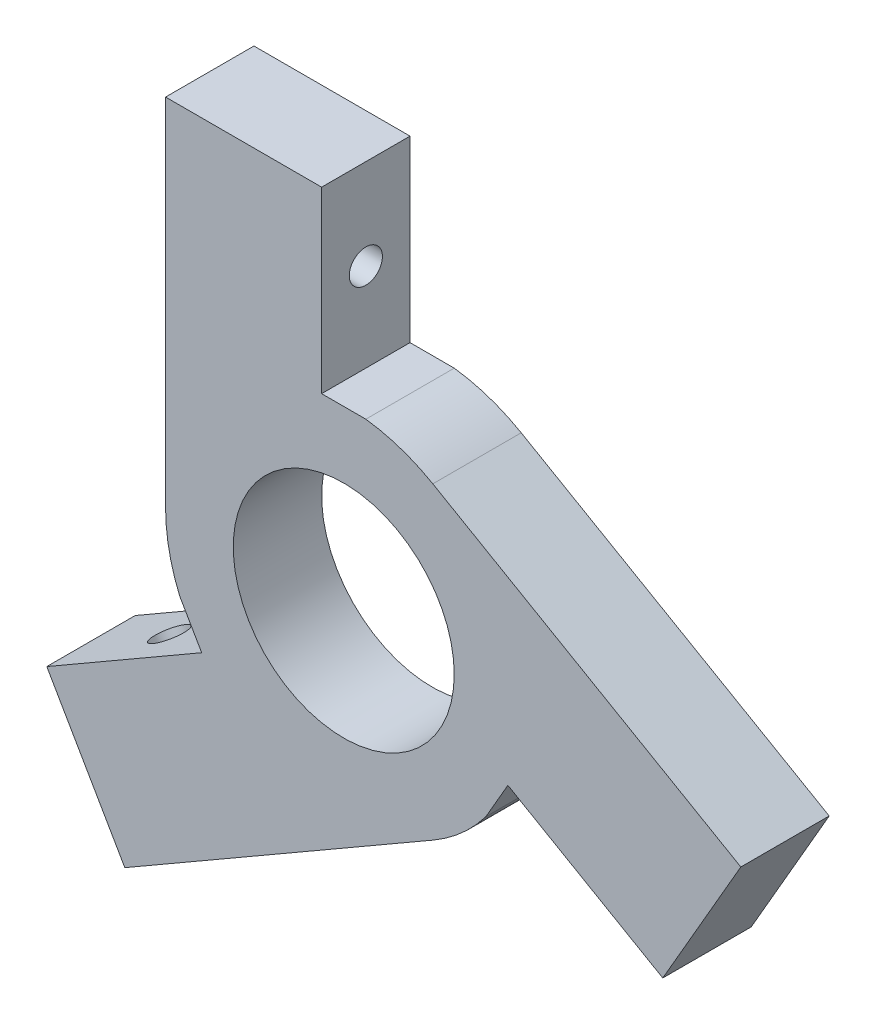
ISO-10303-21;
HEADER;
FILE_DESCRIPTION(('STEP AP214'),'2;1');
FILE_NAME('part.step','',(''),(''),'','','');
FILE_SCHEMA(('AUTOMOTIVE_DESIGN { 1 0 10303 214 1 1 1 1 }'));
ENDSEC;
DATA;
#1=APPLICATION_CONTEXT('core data for automotive mechanical design processes');
#2=APPLICATION_PROTOCOL_DEFINITION('international standard','automotive_design',2000,#1);
#3=PRODUCT_CONTEXT('',#1,'mechanical');
#4=PRODUCT('Part','Part','',(#3));
#5=PRODUCT_RELATED_PRODUCT_CATEGORY('part','',(#4));
#6=PRODUCT_DEFINITION_FORMATION('','',#4);
#7=PRODUCT_DEFINITION_CONTEXT('part definition',#1,'design');
#8=PRODUCT_DEFINITION('design','',#6,#7);
#9=PRODUCT_DEFINITION_SHAPE('','',#8);
#10=(LENGTH_UNIT() NAMED_UNIT(*) SI_UNIT(.MILLI.,.METRE.));
#11=(NAMED_UNIT(*) PLANE_ANGLE_UNIT() SI_UNIT($,.RADIAN.));
#12=(NAMED_UNIT(*) SI_UNIT($,.STERADIAN.) SOLID_ANGLE_UNIT());
#13=UNCERTAINTY_MEASURE_WITH_UNIT(LENGTH_MEASURE(1.E-05),#10,'distance_accuracy_value','');
#14=(GEOMETRIC_REPRESENTATION_CONTEXT(3) GLOBAL_UNCERTAINTY_ASSIGNED_CONTEXT((#13)) GLOBAL_UNIT_ASSIGNED_CONTEXT((#10,
#11,#12)) REPRESENTATION_CONTEXT('',''));
#15=CARTESIAN_POINT('',(0.,0.,0.));
#16=DIRECTION('',(0.,0.,1.));
#17=DIRECTION('',(1.,0.,0.));
#18=AXIS2_PLACEMENT_3D('',#15,#16,#17);
#19=CARTESIAN_POINT('',(0.,0.,12.7));
#20=DIRECTION('',(0.,0.,1.));
#21=DIRECTION('',(1.,0.,0.));
#22=AXIS2_PLACEMENT_3D('',#19,#20,#21);
#23=PLANE('',#22);
#24=CARTESIAN_POINT('',(0.,0.,12.7));
#25=DIRECTION('',(0.,0.,1.));
#26=DIRECTION('',(1.,0.,0.));
#27=AXIS2_PLACEMENT_3D('',#24,#25,#26);
#28=CIRCLE('',#27,51.1953367016958);
#29=CARTESIAN_POINT('',(25.5976683508479,44.3364621389664,12.7));
#30=VERTEX_POINT('',#29);
#31=CARTESIAN_POINT('',(6.35000000000002,50.8,12.7));
#32=VERTEX_POINT('',#31);
#33=EDGE_CURVE('E204',#30,#32,#28,.T.);
#34=ORIENTED_EDGE('',*,*,#33,.T.);
#35=DIRECTION('',(-1.,0.,0.));
#36=VECTOR('',#35,1.);
#37=CARTESIAN_POINT('',(-6.34999999999998,50.8,12.7));
#38=LINE('',#37,#36);
#39=CARTESIAN_POINT('',(-6.34999999999998,50.8,12.7));
#40=VERTEX_POINT('',#39);
#41=EDGE_CURVE('E117',#32,#40,#38,.T.);
#42=ORIENTED_EDGE('',*,*,#41,.T.);
#43=DIRECTION('',(0.,1.,0.));
#44=VECTOR('',#43,1.);
#45=CARTESIAN_POINT('',(-6.35000000000016,102.193578565387,12.7));
#46=LINE('',#45,#44);
#47=CARTESIAN_POINT('',(-6.35000000000016,102.193578565387,12.7));
#48=VERTEX_POINT('',#47);
#49=EDGE_CURVE('E240',#40,#48,#46,.T.);
#50=ORIENTED_EDGE('',*,*,#49,.T.);
#51=DIRECTION('',(-1.,0.,0.));
#52=VECTOR('',#51,1.);
#53=CARTESIAN_POINT('',(-51.1953367016961,102.193578565387,12.7));
#54=LINE('',#53,#52);
#55=CARTESIAN_POINT('',(-51.1953367016961,102.193578565387,12.7));
#56=VERTEX_POINT('',#55);
#57=EDGE_CURVE('E259',#48,#56,#54,.T.);
#58=ORIENTED_EDGE('',*,*,#57,.T.);
#59=DIRECTION('',(0.,-1.,0.));
#60=VECTOR('',#59,1.);
#61=CARTESIAN_POINT('',(-51.1953367016958,0.,12.7));
#62=LINE('',#61,#60);
#63=CARTESIAN_POINT('',(-51.1953367016958,0.,12.7));
#64=VERTEX_POINT('',#63);
#65=EDGE_CURVE('E256',#56,#64,#62,.T.);
#66=ORIENTED_EDGE('',*,*,#65,.T.);
#67=CARTESIAN_POINT('',(0.,0.,12.7));
#68=DIRECTION('',(0.,0.,1.));
#69=DIRECTION('',(1.,0.,0.));
#70=AXIS2_PLACEMENT_3D('',#67,#68,#69);
#71=CIRCLE('',#70,51.1953367016958);
#72=CARTESIAN_POINT('',(-47.1690905122495,-19.9007386859688,12.7));
#73=VERTEX_POINT('',#72);
#74=EDGE_CURVE('E258',#64,#73,#71,.T.);
#75=ORIENTED_EDGE('',*,*,#74,.T.);
#76=DIRECTION('',(0.5,-0.866025403784439,0.));
#77=VECTOR('',#76,1.);
#78=CARTESIAN_POINT('',(-40.8190905122495,-30.8992613140312,12.7));
#79=LINE('',#78,#77);
#80=CARTESIAN_POINT('',(-40.8190905122495,-30.8992613140312,12.7));
#81=VERTEX_POINT('',#80);
#82=EDGE_CURVE('E261',#73,#81,#79,.T.);
#83=ORIENTED_EDGE('',*,*,#82,.T.);
#84=DIRECTION('',(-0.866025403784438,-0.500000000000001,0.));
#85=VECTOR('',#84,1.);
#86=CARTESIAN_POINT('',(-85.3272351412662,-56.5960505967249,12.7));
#87=LINE('',#86,#85);
#88=CARTESIAN_POINT('',(-85.3272351412662,-56.5960505967249,12.7));
#89=VERTEX_POINT('',#88);
#90=EDGE_CURVE('E267',#81,#89,#87,.T.);
#91=ORIENTED_EDGE('',*,*,#90,.T.);
#92=DIRECTION('',(0.499999999999999,-0.866025403784439,0.));
#93=VECTOR('',#92,1.);
#94=CARTESIAN_POINT('',(-62.9045667904184,-95.4332514216601,12.7));
#95=LINE('',#94,#93);
#96=CARTESIAN_POINT('',(-62.9045667904184,-95.4332514216601,12.7));
#97=VERTEX_POINT('',#96);
#98=EDGE_CURVE('E269',#89,#97,#95,.T.);
#99=ORIENTED_EDGE('',*,*,#98,.T.);
#100=DIRECTION('',(0.866025403784438,0.500000000000001,0.));
#101=VECTOR('',#100,1.);
#102=CARTESIAN_POINT('',(25.5976683508479,-44.3364621389664,12.7));
#103=LINE('',#102,#101);
#104=CARTESIAN_POINT('',(25.5976683508479,-44.3364621389664,12.7));
#105=VERTEX_POINT('',#104);
#106=EDGE_CURVE('E271',#97,#105,#103,.T.);
#107=ORIENTED_EDGE('',*,*,#106,.T.);
#108=CARTESIAN_POINT('',(0.,0.,12.7));
#109=DIRECTION('',(0.,0.,1.));
#110=DIRECTION('',(1.,0.,0.));
#111=AXIS2_PLACEMENT_3D('',#108,#109,#110);
#112=CIRCLE('',#111,51.1953367016958);
#113=CARTESIAN_POINT('',(40.8190905122495,-30.8992613140312,12.7));
#114=VERTEX_POINT('',#113);
#115=EDGE_CURVE('E273',#105,#114,#112,.T.);
#116=ORIENTED_EDGE('',*,*,#115,.T.);
#117=DIRECTION('',(0.5,0.866025403784439,0.));
#118=VECTOR('',#117,1.);
#119=CARTESIAN_POINT('',(47.1690905122495,-19.9007386859688,12.7));
#120=LINE('',#119,#118);
#121=CARTESIAN_POINT('',(47.1690905122495,-19.9007386859688,12.7));
#122=VERTEX_POINT('',#121);
#123=EDGE_CURVE('E157',#114,#122,#120,.T.);
#124=ORIENTED_EDGE('',*,*,#123,.T.);
#125=DIRECTION('',(0.866025403784439,-0.5,0.));
#126=VECTOR('',#125,1.);
#127=CARTESIAN_POINT('',(91.6772351412663,-45.5975279686624,12.7));
#128=LINE('',#127,#126);
#129=CARTESIAN_POINT('',(91.6772351412663,-45.5975279686624,12.7));
#130=VERTEX_POINT('',#129);
#131=EDGE_CURVE('E151',#122,#130,#128,.T.);
#132=ORIENTED_EDGE('',*,*,#131,.T.);
#133=DIRECTION('',(0.500000000000001,0.866025403784438,0.));
#134=VECTOR('',#133,1.);
#135=CARTESIAN_POINT('',(114.099903492114,-6.76032714372728,12.7));
#136=LINE('',#135,#134);
#137=CARTESIAN_POINT('',(114.099903492114,-6.76032714372728,12.7));
#138=VERTEX_POINT('',#137);
#139=EDGE_CURVE('E155',#130,#138,#136,.T.);
#140=ORIENTED_EDGE('',*,*,#139,.T.);
#141=DIRECTION('',(-0.866025403784439,0.5,0.));
#142=VECTOR('',#141,1.);
#143=CARTESIAN_POINT('',(25.5976683508479,44.3364621389664,12.7));
#144=LINE('',#143,#142);
#145=EDGE_CURVE('E53',#138,#30,#144,.T.);
#146=ORIENTED_EDGE('',*,*,#145,.T.);
#147=EDGE_LOOP('',(#34,#42,#50,#58,#66,#75,#83,#91,#99,#107,#116,#124,#132,#140,#146));
#148=FACE_BOUND('',#147,.T.);
#149=CARTESIAN_POINT('',(0.,0.,12.7));
#150=DIRECTION('',(0.,0.,1.));
#151=DIRECTION('',(1.,0.,0.));
#152=AXIS2_PLACEMENT_3D('',#149,#150,#151);
#153=CIRCLE('',#152,31.75);
#154=CARTESIAN_POINT('',(31.75,0.,12.7));
#155=VERTEX_POINT('',#154);
#156=EDGE_CURVE('E179',#155,#155,#153,.T.);
#157=ORIENTED_EDGE('',*,*,#156,.F.);
#158=EDGE_LOOP('',(#157));
#159=FACE_BOUND('',#158,.T.);
#160=ADVANCED_FACE('F36',(#148,#159),#23,.T.);
#161=CARTESIAN_POINT('',(0.,0.,-12.7));
#162=DIRECTION('',(0.,0.,1.));
#163=DIRECTION('',(1.,0.,0.));
#164=AXIS2_PLACEMENT_3D('',#161,#162,#163);
#165=PLANE('',#164);
#166=CARTESIAN_POINT('',(0.,0.,-12.7));
#167=DIRECTION('',(0.,0.,1.));
#168=DIRECTION('',(1.,0.,0.));
#169=AXIS2_PLACEMENT_3D('',#166,#167,#168);
#170=CIRCLE('',#169,51.1953367016958);
#171=CARTESIAN_POINT('',(25.5976683508479,44.3364621389664,-12.7));
#172=VERTEX_POINT('',#171);
#173=CARTESIAN_POINT('',(6.35000000000002,50.8,-12.7));
#174=VERTEX_POINT('',#173);
#175=EDGE_CURVE('E175',#172,#174,#170,.T.);
#176=ORIENTED_EDGE('',*,*,#175,.F.);
#177=DIRECTION('',(-0.866025403784439,0.5,0.));
#178=VECTOR('',#177,1.);
#179=CARTESIAN_POINT('',(25.5976683508479,44.3364621389664,-12.7));
#180=LINE('',#179,#178);
#181=CARTESIAN_POINT('',(114.099903492114,-6.76032714372728,-12.7));
#182=VERTEX_POINT('',#181);
#183=EDGE_CURVE('E109',#182,#172,#180,.T.);
#184=ORIENTED_EDGE('',*,*,#183,.F.);
#185=DIRECTION('',(0.500000000000001,0.866025403784438,0.));
#186=VECTOR('',#185,1.);
#187=CARTESIAN_POINT('',(114.099903492114,-6.76032714372728,-12.7));
#188=LINE('',#187,#186);
#189=CARTESIAN_POINT('',(91.6772351412663,-45.5975279686624,-12.7));
#190=VERTEX_POINT('',#189);
#191=EDGE_CURVE('E103',#190,#182,#188,.T.);
#192=ORIENTED_EDGE('',*,*,#191,.F.);
#193=DIRECTION('',(0.866025403784439,-0.5,0.));
#194=VECTOR('',#193,1.);
#195=CARTESIAN_POINT('',(91.6772351412663,-45.5975279686624,-12.7));
#196=LINE('',#195,#194);
#197=CARTESIAN_POINT('',(47.1690905122495,-19.9007386859688,-12.7));
#198=VERTEX_POINT('',#197);
#199=EDGE_CURVE('E165',#198,#190,#196,.T.);
#200=ORIENTED_EDGE('',*,*,#199,.F.);
#201=DIRECTION('',(0.5,0.866025403784439,0.));
#202=VECTOR('',#201,1.);
#203=CARTESIAN_POINT('',(47.1690905122495,-19.9007386859688,-12.7));
#204=LINE('',#203,#202);
#205=CARTESIAN_POINT('',(40.8190905122495,-30.8992613140312,-12.7));
#206=VERTEX_POINT('',#205);
#207=EDGE_CURVE('E199',#206,#198,#204,.T.);
#208=ORIENTED_EDGE('',*,*,#207,.F.);
#209=CARTESIAN_POINT('',(0.,0.,-12.7));
#210=DIRECTION('',(0.,0.,1.));
#211=DIRECTION('',(1.,0.,0.));
#212=AXIS2_PLACEMENT_3D('',#209,#210,#211);
#213=CIRCLE('',#212,51.1953367016958);
#214=CARTESIAN_POINT('',(25.5976683508479,-44.3364621389664,-12.7));
#215=VERTEX_POINT('',#214);
#216=EDGE_CURVE('E197',#215,#206,#213,.T.);
#217=ORIENTED_EDGE('',*,*,#216,.F.);
#218=DIRECTION('',(0.866025403784438,0.500000000000001,0.));
#219=VECTOR('',#218,1.);
#220=CARTESIAN_POINT('',(25.5976683508479,-44.3364621389664,-12.7));
#221=LINE('',#220,#219);
#222=CARTESIAN_POINT('',(-62.9045667904184,-95.4332514216601,-12.7));
#223=VERTEX_POINT('',#222);
#224=EDGE_CURVE('E195',#223,#215,#221,.T.);
#225=ORIENTED_EDGE('',*,*,#224,.F.);
#226=DIRECTION('',(0.499999999999999,-0.866025403784439,0.));
#227=VECTOR('',#226,1.);
#228=CARTESIAN_POINT('',(-62.9045667904184,-95.4332514216601,-12.7));
#229=LINE('',#228,#227);
#230=CARTESIAN_POINT('',(-85.3272351412662,-56.5960505967249,-12.7));
#231=VERTEX_POINT('',#230);
#232=EDGE_CURVE('E193',#231,#223,#229,.T.);
#233=ORIENTED_EDGE('',*,*,#232,.F.);
#234=DIRECTION('',(-0.866025403784438,-0.500000000000001,0.));
#235=VECTOR('',#234,1.);
#236=CARTESIAN_POINT('',(-85.3272351412662,-56.5960505967249,-12.7));
#237=LINE('',#236,#235);
#238=CARTESIAN_POINT('',(-40.8190905122495,-30.8992613140312,-12.7));
#239=VERTEX_POINT('',#238);
#240=EDGE_CURVE('E191',#239,#231,#237,.T.);
#241=ORIENTED_EDGE('',*,*,#240,.F.);
#242=DIRECTION('',(0.5,-0.866025403784439,0.));
#243=VECTOR('',#242,1.);
#244=CARTESIAN_POINT('',(-40.8190905122495,-30.8992613140312,-12.7));
#245=LINE('',#244,#243);
#246=CARTESIAN_POINT('',(-47.1690905122495,-19.9007386859688,-12.7));
#247=VERTEX_POINT('',#246);
#248=EDGE_CURVE('E189',#247,#239,#245,.T.);
#249=ORIENTED_EDGE('',*,*,#248,.F.);
#250=CARTESIAN_POINT('',(0.,0.,-12.7));
#251=DIRECTION('',(0.,0.,1.));
#252=DIRECTION('',(1.,0.,0.));
#253=AXIS2_PLACEMENT_3D('',#250,#251,#252);
#254=CIRCLE('',#253,51.1953367016958);
#255=CARTESIAN_POINT('',(-51.1953367016958,0.,-12.7));
#256=VERTEX_POINT('',#255);
#257=EDGE_CURVE('E187',#256,#247,#254,.T.);
#258=ORIENTED_EDGE('',*,*,#257,.F.);
#259=DIRECTION('',(0.,-1.,0.));
#260=VECTOR('',#259,1.);
#261=CARTESIAN_POINT('',(-51.1953367016958,0.,-12.7));
#262=LINE('',#261,#260);
#263=CARTESIAN_POINT('',(-51.1953367016961,102.193578565387,-12.7));
#264=VERTEX_POINT('',#263);
#265=EDGE_CURVE('E185',#264,#256,#262,.T.);
#266=ORIENTED_EDGE('',*,*,#265,.F.);
#267=DIRECTION('',(-1.,0.,0.));
#268=VECTOR('',#267,1.);
#269=CARTESIAN_POINT('',(-51.1953367016961,102.193578565387,-12.7));
#270=LINE('',#269,#268);
#271=CARTESIAN_POINT('',(-6.35000000000016,102.193578565387,-12.7));
#272=VERTEX_POINT('',#271);
#273=EDGE_CURVE('E183',#272,#264,#270,.T.);
#274=ORIENTED_EDGE('',*,*,#273,.F.);
#275=DIRECTION('',(0.,1.,0.));
#276=VECTOR('',#275,1.);
#277=CARTESIAN_POINT('',(-6.35000000000016,102.193578565387,-12.7));
#278=LINE('',#277,#276);
#279=CARTESIAN_POINT('',(-6.34999999999998,50.8,-12.7));
#280=VERTEX_POINT('',#279);
#281=EDGE_CURVE('E181',#280,#272,#278,.T.);
#282=ORIENTED_EDGE('',*,*,#281,.F.);
#283=DIRECTION('',(-1.,0.,0.));
#284=VECTOR('',#283,1.);
#285=CARTESIAN_POINT('',(-6.34999999999998,50.8,-12.7));
#286=LINE('',#285,#284);
#287=EDGE_CURVE('E178',#174,#280,#286,.T.);
#288=ORIENTED_EDGE('',*,*,#287,.F.);
#289=EDGE_LOOP('',(#176,#184,#192,#200,#208,#217,#225,#233,#241,#249,#258,#266,#274,#282,#288));
#290=FACE_BOUND('',#289,.T.);
#291=CARTESIAN_POINT('',(0.,0.,-12.7));
#292=DIRECTION('',(0.,0.,1.));
#293=DIRECTION('',(1.,0.,0.));
#294=AXIS2_PLACEMENT_3D('',#291,#292,#293);
#295=CIRCLE('',#294,31.75);
#296=CARTESIAN_POINT('',(31.75,0.,-12.7));
#297=VERTEX_POINT('',#296);
#298=EDGE_CURVE('E349',#297,#297,#295,.T.);
#299=ORIENTED_EDGE('',*,*,#298,.T.);
#300=EDGE_LOOP('',(#299));
#301=FACE_BOUND('',#300,.T.);
#302=ADVANCED_FACE('F244',(#290,#301),#165,.F.);
#303=CARTESIAN_POINT('',(0.,0.,12.7));
#304=DIRECTION('',(0.,0.,-1.));
#305=DIRECTION('',(-1.,0.,0.));
#306=AXIS2_PLACEMENT_3D('',#303,#304,#305);
#307=CYLINDRICAL_SURFACE('',#306,51.1953367016958);
#308=ORIENTED_EDGE('',*,*,#175,.T.);
#309=DIRECTION('',(0.,0.,-1.));
#310=VECTOR('',#309,1.);
#311=CARTESIAN_POINT('',(6.35000000000002,50.8,12.7));
#312=LINE('',#311,#310);
#313=EDGE_CURVE('E11',#32,#174,#312,.T.);
#314=ORIENTED_EDGE('',*,*,#313,.F.);
#315=ORIENTED_EDGE('',*,*,#33,.F.);
#316=DIRECTION('',(0.,0.,-1.));
#317=VECTOR('',#316,1.);
#318=CARTESIAN_POINT('',(25.5976683508479,44.3364621389664,12.7));
#319=LINE('',#318,#317);
#320=EDGE_CURVE('E171',#30,#172,#319,.T.);
#321=ORIENTED_EDGE('',*,*,#320,.T.);
#322=EDGE_LOOP('',(#308,#314,#315,#321));
#323=FACE_BOUND('',#322,.T.);
#324=ADVANCED_FACE('F38',(#323),#307,.T.);
#325=CARTESIAN_POINT('',(-6.34999999999998,50.8,12.7));
#326=DIRECTION('',(0.,-1.,0.));
#327=DIRECTION('',(0.,0.,-1.));
#328=AXIS2_PLACEMENT_3D('',#325,#326,#327);
#329=PLANE('',#328);
#330=ORIENTED_EDGE('',*,*,#287,.T.);
#331=DIRECTION('',(0.,0.,-1.));
#332=VECTOR('',#331,1.);
#333=CARTESIAN_POINT('',(-6.34999999999998,50.8,12.7));
#334=LINE('',#333,#332);
#335=EDGE_CURVE('E45',#40,#280,#334,.T.);
#336=ORIENTED_EDGE('',*,*,#335,.F.);
#337=ORIENTED_EDGE('',*,*,#41,.F.);
#338=ORIENTED_EDGE('',*,*,#313,.T.);
#339=EDGE_LOOP('',(#330,#336,#337,#338));
#340=FACE_BOUND('',#339,.T.);
#341=ADVANCED_FACE('F364',(#340),#329,.F.);
#342=CARTESIAN_POINT('',(-6.35000000000016,102.193578565387,12.7));
#343=DIRECTION('',(-1.,0.,0.));
#344=DIRECTION('',(0.,-1.,0.));
#345=AXIS2_PLACEMENT_3D('',#342,#343,#344);
#346=PLANE('',#345);
#347=CARTESIAN_POINT('',(-6.35000000000007,76.2,0.));
#348=DIRECTION('',(1.,0.,0.));
#349=DIRECTION('',(0.,1.,0.));
#350=AXIS2_PLACEMENT_3D('',#347,#348,#349);
#351=CIRCLE('',#350,4.7625);
#352=CARTESIAN_POINT('',(-6.35000000000008,80.9625,0.));
#353=VERTEX_POINT('',#352);
#354=EDGE_CURVE('E333',#353,#353,#351,.T.);
#355=ORIENTED_EDGE('',*,*,#354,.F.);
#356=EDGE_LOOP('',(#355));
#357=FACE_BOUND('',#356,.T.);
#358=ORIENTED_EDGE('',*,*,#281,.T.);
#359=DIRECTION('',(0.,0.,-1.));
#360=VECTOR('',#359,1.);
#361=CARTESIAN_POINT('',(-6.35000000000016,102.193578565387,12.7));
#362=LINE('',#361,#360);
#363=EDGE_CURVE('E232',#48,#272,#362,.T.);
#364=ORIENTED_EDGE('',*,*,#363,.F.);
#365=ORIENTED_EDGE('',*,*,#49,.F.);
#366=ORIENTED_EDGE('',*,*,#335,.T.);
#367=EDGE_LOOP('',(#358,#364,#365,#366));
#368=FACE_BOUND('',#367,.T.);
#369=ADVANCED_FACE('F238',(#357,#368),#346,.F.);
#370=CARTESIAN_POINT('',(-51.1953367016961,102.193578565387,12.7));
#371=DIRECTION('',(0.,-1.,0.));
#372=DIRECTION('',(0.,0.,-1.));
#373=AXIS2_PLACEMENT_3D('',#370,#371,#372);
#374=PLANE('',#373);
#375=ORIENTED_EDGE('',*,*,#273,.T.);
#376=DIRECTION('',(0.,0.,-1.));
#377=VECTOR('',#376,1.);
#378=CARTESIAN_POINT('',(-51.1953367016961,102.193578565387,12.7));
#379=LINE('',#378,#377);
#380=EDGE_CURVE('E229',#56,#264,#379,.T.);
#381=ORIENTED_EDGE('',*,*,#380,.F.);
#382=ORIENTED_EDGE('',*,*,#57,.F.);
#383=ORIENTED_EDGE('',*,*,#363,.T.);
#384=EDGE_LOOP('',(#375,#381,#382,#383));
#385=FACE_BOUND('',#384,.T.);
#386=ADVANCED_FACE('F250',(#385),#374,.F.);
#387=CARTESIAN_POINT('',(-51.1953367016958,0.,12.7));
#388=DIRECTION('',(1.,0.,0.));
#389=DIRECTION('',(0.,1.,0.));
#390=AXIS2_PLACEMENT_3D('',#387,#388,#389);
#391=PLANE('',#390);
#392=ORIENTED_EDGE('',*,*,#265,.T.);
#393=DIRECTION('',(0.,0.,-1.));
#394=VECTOR('',#393,1.);
#395=CARTESIAN_POINT('',(-51.1953367016958,0.,12.7));
#396=LINE('',#395,#394);
#397=EDGE_CURVE('E226',#64,#256,#396,.T.);
#398=ORIENTED_EDGE('',*,*,#397,.F.);
#399=ORIENTED_EDGE('',*,*,#65,.F.);
#400=ORIENTED_EDGE('',*,*,#380,.T.);
#401=EDGE_LOOP('',(#392,#398,#399,#400));
#402=FACE_BOUND('',#401,.T.);
#403=ADVANCED_FACE('F254',(#402),#391,.F.);
#404=CARTESIAN_POINT('',(0.,0.,12.7));
#405=DIRECTION('',(0.,0.,-1.));
#406=DIRECTION('',(-1.,0.,0.));
#407=AXIS2_PLACEMENT_3D('',#404,#405,#406);
#408=CYLINDRICAL_SURFACE('',#407,51.1953367016958);
#409=ORIENTED_EDGE('',*,*,#257,.T.);
#410=DIRECTION('',(0.,0.,-1.));
#411=VECTOR('',#410,1.);
#412=CARTESIAN_POINT('',(-47.1690905122495,-19.9007386859688,12.7));
#413=LINE('',#412,#411);
#414=EDGE_CURVE('E223',#73,#247,#413,.T.);
#415=ORIENTED_EDGE('',*,*,#414,.F.);
#416=ORIENTED_EDGE('',*,*,#74,.F.);
#417=ORIENTED_EDGE('',*,*,#397,.T.);
#418=EDGE_LOOP('',(#409,#415,#416,#417));
#419=FACE_BOUND('',#418,.T.);
#420=ADVANCED_FACE('F374',(#419),#408,.T.);
#421=CARTESIAN_POINT('',(-40.8190905122495,-30.8992613140312,12.7));
#422=DIRECTION('',(0.866025403784438,0.5,0.));
#423=DIRECTION('',(-0.5,0.866025403784439,0.));
#424=AXIS2_PLACEMENT_3D('',#421,#422,#423);
#425=PLANE('',#424);
#426=ORIENTED_EDGE('',*,*,#248,.T.);
#427=DIRECTION('',(0.,0.,-1.));
#428=VECTOR('',#427,1.);
#429=CARTESIAN_POINT('',(-40.8190905122495,-30.8992613140312,12.7));
#430=LINE('',#429,#428);
#431=EDGE_CURVE('E220',#81,#239,#430,.T.);
#432=ORIENTED_EDGE('',*,*,#431,.F.);
#433=ORIENTED_EDGE('',*,*,#82,.F.);
#434=ORIENTED_EDGE('',*,*,#414,.T.);
#435=EDGE_LOOP('',(#426,#432,#433,#434));
#436=FACE_BOUND('',#435,.T.);
#437=ADVANCED_FACE('F377',(#436),#425,.F.);
#438=CARTESIAN_POINT('',(-85.3272351412662,-56.5960505967249,12.7));
#439=DIRECTION('',(0.500000000000001,-0.866025403784438,0.));
#440=DIRECTION('',(0.866025403784438,0.500000000000001,0.));
#441=AXIS2_PLACEMENT_3D('',#438,#439,#440);
#442=PLANE('',#441);
#443=CARTESIAN_POINT('',(-62.816135768374,-43.5992613140315,0.));
#444=DIRECTION('',(-0.500000000000007,0.866025403784435,0.));
#445=DIRECTION('',(-0.866025403784435,-0.500000000000007,0.));
#446=AXIS2_PLACEMENT_3D('',#443,#444,#445);
#447=CIRCLE('',#446,4.7625);
#448=CARTESIAN_POINT('',(-66.9405817538974,-45.9805113140316,0.));
#449=VERTEX_POINT('',#448);
#450=EDGE_CURVE('E334',#449,#449,#447,.T.);
#451=ORIENTED_EDGE('',*,*,#450,.F.);
#452=EDGE_LOOP('',(#451));
#453=FACE_BOUND('',#452,.T.);
#454=ORIENTED_EDGE('',*,*,#240,.T.);
#455=DIRECTION('',(0.,0.,-1.));
#456=VECTOR('',#455,1.);
#457=CARTESIAN_POINT('',(-85.3272351412662,-56.5960505967249,12.7));
#458=LINE('',#457,#456);
#459=EDGE_CURVE('E217',#89,#231,#458,.T.);
#460=ORIENTED_EDGE('',*,*,#459,.F.);
#461=ORIENTED_EDGE('',*,*,#90,.F.);
#462=ORIENTED_EDGE('',*,*,#431,.T.);
#463=EDGE_LOOP('',(#454,#460,#461,#462));
#464=FACE_BOUND('',#463,.T.);
#465=ADVANCED_FACE('F381',(#453,#464),#442,.F.);
#466=CARTESIAN_POINT('',(-62.9045667904184,-95.4332514216601,12.7));
#467=DIRECTION('',(0.866025403784439,0.499999999999999,0.));
#468=DIRECTION('',(-0.499999999999999,0.866025403784439,0.));
#469=AXIS2_PLACEMENT_3D('',#466,#467,#468);
#470=PLANE('',#469);
#471=ORIENTED_EDGE('',*,*,#232,.T.);
#472=DIRECTION('',(0.,0.,-1.));
#473=VECTOR('',#472,1.);
#474=CARTESIAN_POINT('',(-62.9045667904184,-95.4332514216601,12.7));
#475=LINE('',#474,#473);
#476=EDGE_CURVE('E214',#97,#223,#475,.T.);
#477=ORIENTED_EDGE('',*,*,#476,.F.);
#478=ORIENTED_EDGE('',*,*,#98,.F.);
#479=ORIENTED_EDGE('',*,*,#459,.T.);
#480=EDGE_LOOP('',(#471,#477,#478,#479));
#481=FACE_BOUND('',#480,.T.);
#482=ADVANCED_FACE('F385',(#481),#470,.F.);
#483=CARTESIAN_POINT('',(25.5976683508479,-44.3364621389664,12.7));
#484=DIRECTION('',(-0.500000000000001,0.866025403784438,0.));
#485=DIRECTION('',(-0.866025403784438,-0.500000000000001,0.));
#486=AXIS2_PLACEMENT_3D('',#483,#484,#485);
#487=PLANE('',#486);
#488=ORIENTED_EDGE('',*,*,#224,.T.);
#489=DIRECTION('',(0.,0.,-1.));
#490=VECTOR('',#489,1.);
#491=CARTESIAN_POINT('',(25.5976683508479,-44.3364621389664,12.7));
#492=LINE('',#491,#490);
#493=EDGE_CURVE('E211',#105,#215,#492,.T.);
#494=ORIENTED_EDGE('',*,*,#493,.F.);
#495=ORIENTED_EDGE('',*,*,#106,.F.);
#496=ORIENTED_EDGE('',*,*,#476,.T.);
#497=EDGE_LOOP('',(#488,#494,#495,#496));
#498=FACE_BOUND('',#497,.T.);
#499=ADVANCED_FACE('F389',(#498),#487,.F.);
#500=CARTESIAN_POINT('',(0.,0.,12.7));
#501=DIRECTION('',(0.,0.,-1.));
#502=DIRECTION('',(-1.,0.,0.));
#503=AXIS2_PLACEMENT_3D('',#500,#501,#502);
#504=CYLINDRICAL_SURFACE('',#503,51.1953367016958);
#505=ORIENTED_EDGE('',*,*,#216,.T.);
#506=DIRECTION('',(0.,0.,-1.));
#507=VECTOR('',#506,1.);
#508=CARTESIAN_POINT('',(40.8190905122495,-30.8992613140312,12.7));
#509=LINE('',#508,#507);
#510=EDGE_CURVE('E208',#114,#206,#509,.T.);
#511=ORIENTED_EDGE('',*,*,#510,.F.);
#512=ORIENTED_EDGE('',*,*,#115,.F.);
#513=ORIENTED_EDGE('',*,*,#493,.T.);
#514=EDGE_LOOP('',(#505,#511,#512,#513));
#515=FACE_BOUND('',#514,.T.);
#516=ADVANCED_FACE('F279',(#515),#504,.T.);
#517=CARTESIAN_POINT('',(47.1690905122495,-19.9007386859688,12.7));
#518=DIRECTION('',(-0.866025403784439,0.5,0.));
#519=DIRECTION('',(-0.5,-0.866025403784439,0.));
#520=AXIS2_PLACEMENT_3D('',#517,#518,#519);
#521=PLANE('',#520);
#522=ORIENTED_EDGE('',*,*,#207,.T.);
#523=DIRECTION('',(0.,0.,-1.));
#524=VECTOR('',#523,1.);
#525=CARTESIAN_POINT('',(47.1690905122495,-19.9007386859688,12.7));
#526=LINE('',#525,#524);
#527=EDGE_CURVE('E166',#122,#198,#526,.T.);
#528=ORIENTED_EDGE('',*,*,#527,.F.);
#529=ORIENTED_EDGE('',*,*,#123,.F.);
#530=ORIENTED_EDGE('',*,*,#510,.T.);
#531=EDGE_LOOP('',(#522,#528,#529,#530));
#532=FACE_BOUND('',#531,.T.);
#533=ADVANCED_FACE('F283',(#532),#521,.F.);
#534=CARTESIAN_POINT('',(91.6772351412663,-45.5975279686624,12.7));
#535=DIRECTION('',(0.5,0.866025403784439,0.));
#536=DIRECTION('',(-0.866025403784439,0.5,0.));
#537=AXIS2_PLACEMENT_3D('',#534,#535,#536);
#538=PLANE('',#537);
#539=CARTESIAN_POINT('',(69.1661357683746,-32.6007386859681,0.));
#540=DIRECTION('',(-0.499999999999989,-0.866025403784445,0.));
#541=DIRECTION('',(0.866025403784445,-0.499999999999989,0.));
#542=AXIS2_PLACEMENT_3D('',#539,#540,#541);
#543=CIRCLE('',#542,4.7625);
#544=CARTESIAN_POINT('',(73.290581753898,-34.9819886859681,0.));
#545=VERTEX_POINT('',#544);
#546=EDGE_CURVE('E343',#545,#545,#543,.T.);
#547=ORIENTED_EDGE('',*,*,#546,.F.);
#548=EDGE_LOOP('',(#547));
#549=FACE_BOUND('',#548,.T.);
#550=ORIENTED_EDGE('',*,*,#199,.T.);
#551=DIRECTION('',(0.,0.,-1.));
#552=VECTOR('',#551,1.);
#553=CARTESIAN_POINT('',(91.6772351412663,-45.5975279686624,12.7));
#554=LINE('',#553,#552);
#555=EDGE_CURVE('E162',#130,#190,#554,.T.);
#556=ORIENTED_EDGE('',*,*,#555,.F.);
#557=ORIENTED_EDGE('',*,*,#131,.F.);
#558=ORIENTED_EDGE('',*,*,#527,.T.);
#559=EDGE_LOOP('',(#550,#556,#557,#558));
#560=FACE_BOUND('',#559,.T.);
#561=ADVANCED_FACE('F163',(#549,#560),#538,.F.);
#562=CARTESIAN_POINT('',(114.099903492114,-6.76032714372728,12.7));
#563=DIRECTION('',(-0.866025403784438,0.500000000000001,0.));
#564=DIRECTION('',(-0.500000000000001,-0.866025403784438,0.));
#565=AXIS2_PLACEMENT_3D('',#562,#563,#564);
#566=PLANE('',#565);
#567=ORIENTED_EDGE('',*,*,#191,.T.);
#568=DIRECTION('',(0.,0.,-1.));
#569=VECTOR('',#568,1.);
#570=CARTESIAN_POINT('',(114.099903492114,-6.76032714372728,12.7));
#571=LINE('',#570,#569);
#572=EDGE_CURVE('E167',#138,#182,#571,.T.);
#573=ORIENTED_EDGE('',*,*,#572,.F.);
#574=ORIENTED_EDGE('',*,*,#139,.F.);
#575=ORIENTED_EDGE('',*,*,#555,.T.);
#576=EDGE_LOOP('',(#567,#573,#574,#575));
#577=FACE_BOUND('',#576,.T.);
#578=ADVANCED_FACE('F169',(#577),#566,.F.);
#579=CARTESIAN_POINT('',(25.5976683508479,44.3364621389664,12.7));
#580=DIRECTION('',(-0.5,-0.866025403784439,0.));
#581=DIRECTION('',(0.866025403784439,-0.5,0.));
#582=AXIS2_PLACEMENT_3D('',#579,#580,#581);
#583=PLANE('',#582);
#584=ORIENTED_EDGE('',*,*,#183,.T.);
#585=ORIENTED_EDGE('',*,*,#320,.F.);
#586=ORIENTED_EDGE('',*,*,#145,.F.);
#587=ORIENTED_EDGE('',*,*,#572,.T.);
#588=EDGE_LOOP('',(#584,#585,#586,#587));
#589=FACE_BOUND('',#588,.T.);
#590=ADVANCED_FACE('F287',(#589),#583,.F.);
#591=CARTESIAN_POINT('',(0.,0.,12.7));
#592=DIRECTION('',(0.,0.,-1.));
#593=DIRECTION('',(-1.,0.,0.));
#594=AXIS2_PLACEMENT_3D('',#591,#592,#593);
#595=CYLINDRICAL_SURFACE('',#594,31.75);
#596=ORIENTED_EDGE('',*,*,#156,.T.);
#597=EDGE_LOOP('',(#596));
#598=FACE_BOUND('',#597,.T.);
#599=ORIENTED_EDGE('',*,*,#298,.F.);
#600=EDGE_LOOP('',(#599));
#601=FACE_BOUND('',#600,.T.);
#602=ADVANCED_FACE('F289',(#598,#601),#595,.F.);
#603=CARTESIAN_POINT('',(-31.7500000000001,76.1999999999999,0.));
#604=DIRECTION('',(1.,0.,0.));
#605=DIRECTION('',(0.,1.,0.));
#606=AXIS2_PLACEMENT_3D('',#603,#604,#605);
#607=CYLINDRICAL_SURFACE('',#606,4.7625);
#608=CARTESIAN_POINT('',(-31.7500000000001,76.1999999999999,0.));
#609=DIRECTION('',(1.,0.,0.));
#610=DIRECTION('',(0.,1.,0.));
#611=AXIS2_PLACEMENT_3D('',#608,#609,#610);
#612=CIRCLE('',#611,4.7625);
#613=CARTESIAN_POINT('',(-31.7500000000001,80.9624999999999,0.));
#614=VERTEX_POINT('',#613);
#615=EDGE_CURVE('E337',#614,#614,#612,.T.);
#616=ORIENTED_EDGE('',*,*,#615,.F.);
#617=EDGE_LOOP('',(#616));
#618=FACE_BOUND('',#617,.T.);
#619=ORIENTED_EDGE('',*,*,#354,.T.);
#620=EDGE_LOOP('',(#619));
#621=FACE_BOUND('',#620,.T.);
#622=ADVANCED_FACE('F295',(#618,#621),#607,.F.);
#623=CARTESIAN_POINT('',(-31.7500000000001,76.1999999999999,0.));
#624=DIRECTION('',(1.,0.,0.));
#625=DIRECTION('',(0.,1.,0.));
#626=AXIS2_PLACEMENT_3D('',#623,#624,#625);
#627=PLANE('',#626);
#628=ORIENTED_EDGE('',*,*,#615,.T.);
#629=EDGE_LOOP('',(#628));
#630=FACE_BOUND('',#629,.T.);
#631=ADVANCED_FACE('F308',(#630),#627,.T.);
#632=CARTESIAN_POINT('',(81.8661357683743,-10.6036934298432,0.));
#633=DIRECTION('',(-0.499999999999989,-0.866025403784445,0.));
#634=DIRECTION('',(0.866025403784445,-0.499999999999989,0.));
#635=AXIS2_PLACEMENT_3D('',#632,#633,#634);
#636=CYLINDRICAL_SURFACE('',#635,4.7625);
#637=CARTESIAN_POINT('',(81.8661357683743,-10.6036934298432,0.));
#638=DIRECTION('',(-0.499999999999989,-0.866025403784445,0.));
#639=DIRECTION('',(0.866025403784445,-0.499999999999989,0.));
#640=AXIS2_PLACEMENT_3D('',#637,#638,#639);
#641=CIRCLE('',#640,4.7625);
#642=CARTESIAN_POINT('',(85.9905817538977,-12.9849434298432,0.));
#643=VERTEX_POINT('',#642);
#644=EDGE_CURVE('E340',#643,#643,#641,.T.);
#645=ORIENTED_EDGE('',*,*,#644,.F.);
#646=EDGE_LOOP('',(#645));
#647=FACE_BOUND('',#646,.T.);
#648=ORIENTED_EDGE('',*,*,#546,.T.);
#649=EDGE_LOOP('',(#648));
#650=FACE_BOUND('',#649,.T.);
#651=ADVANCED_FACE('F312',(#647,#650),#636,.F.);
#652=CARTESIAN_POINT('',(81.8661357683743,-10.6036934298432,0.));
#653=DIRECTION('',(-0.499999999999989,-0.866025403784445,0.));
#654=DIRECTION('',(0.866025403784445,-0.499999999999989,0.));
#655=AXIS2_PLACEMENT_3D('',#652,#653,#654);
#656=PLANE('',#655);
#657=ORIENTED_EDGE('',*,*,#644,.T.);
#658=EDGE_LOOP('',(#657));
#659=FACE_BOUND('',#658,.T.);
#660=ADVANCED_FACE('F316',(#659),#656,.T.);
#661=CARTESIAN_POINT('',(-50.1161357683738,-65.5963065701562,0.));
#662=DIRECTION('',(-0.500000000000007,0.866025403784435,0.));
#663=DIRECTION('',(-0.866025403784435,-0.500000000000007,0.));
#664=AXIS2_PLACEMENT_3D('',#661,#662,#663);
#665=CYLINDRICAL_SURFACE('',#664,4.7625);
#666=CARTESIAN_POINT('',(-50.1161357683738,-65.5963065701562,0.));
#667=DIRECTION('',(-0.500000000000007,0.866025403784435,0.));
#668=DIRECTION('',(-0.866025403784435,-0.500000000000007,0.));
#669=AXIS2_PLACEMENT_3D('',#666,#667,#668);
#670=CIRCLE('',#669,4.7625);
#671=CARTESIAN_POINT('',(-54.2405817538972,-67.9775565701562,0.));
#672=VERTEX_POINT('',#671);
#673=EDGE_CURVE('E332',#672,#672,#670,.T.);
#674=ORIENTED_EDGE('',*,*,#673,.F.);
#675=EDGE_LOOP('',(#674));
#676=FACE_BOUND('',#675,.T.);
#677=ORIENTED_EDGE('',*,*,#450,.T.);
#678=EDGE_LOOP('',(#677));
#679=FACE_BOUND('',#678,.T.);
#680=ADVANCED_FACE('F320',(#676,#679),#665,.F.);
#681=CARTESIAN_POINT('',(-50.1161357683738,-65.5963065701562,0.));
#682=DIRECTION('',(-0.500000000000007,0.866025403784435,0.));
#683=DIRECTION('',(-0.866025403784435,-0.500000000000007,0.));
#684=AXIS2_PLACEMENT_3D('',#681,#682,#683);
#685=PLANE('',#684);
#686=ORIENTED_EDGE('',*,*,#673,.T.);
#687=EDGE_LOOP('',(#686));
#688=FACE_BOUND('',#687,.T.);
#689=ADVANCED_FACE('F324',(#688),#685,.T.);
#690=CLOSED_SHELL('',(#160,#302,#324,#341,#369,#386,#403,#420,#437,#465,#482,#499,#516,#533,
#561,#578,#590,#602,#622,#631,#651,#660,#680,#689));
#691=MANIFOLD_SOLID_BREP('B2',#690);
#692=ADVANCED_BREP_SHAPE_REPRESENTATION('',(#18,#691),#14);
#693=SHAPE_DEFINITION_REPRESENTATION(#9,#692);
ENDSEC;
END-ISO-10303-21;
